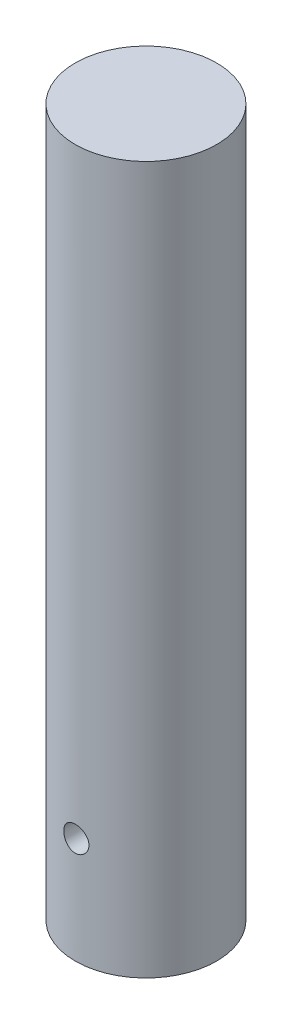
ISO-10303-21;
HEADER;
FILE_DESCRIPTION(('STEP AP214'),'2;1');
FILE_NAME('part.step','',(''),(''),'','','');
FILE_SCHEMA(('AUTOMOTIVE_DESIGN { 1 0 10303 214 1 1 1 1 }'));
ENDSEC;
DATA;
#1=APPLICATION_CONTEXT('core data for automotive mechanical design processes');
#2=APPLICATION_PROTOCOL_DEFINITION('international standard','automotive_design',2000,#1);
#3=PRODUCT_CONTEXT('',#1,'mechanical');
#4=PRODUCT('Part','Part','',(#3));
#5=PRODUCT_RELATED_PRODUCT_CATEGORY('part','',(#4));
#6=PRODUCT_DEFINITION_FORMATION('','',#4);
#7=PRODUCT_DEFINITION_CONTEXT('part definition',#1,'design');
#8=PRODUCT_DEFINITION('design','',#6,#7);
#9=PRODUCT_DEFINITION_SHAPE('','',#8);
#10=(LENGTH_UNIT() NAMED_UNIT(*) SI_UNIT(.MILLI.,.METRE.));
#11=(NAMED_UNIT(*) PLANE_ANGLE_UNIT() SI_UNIT($,.RADIAN.));
#12=(NAMED_UNIT(*) SI_UNIT($,.STERADIAN.) SOLID_ANGLE_UNIT());
#13=UNCERTAINTY_MEASURE_WITH_UNIT(LENGTH_MEASURE(1.E-05),#10,'distance_accuracy_value','');
#14=(GEOMETRIC_REPRESENTATION_CONTEXT(3) GLOBAL_UNCERTAINTY_ASSIGNED_CONTEXT((#13)) GLOBAL_UNIT_ASSIGNED_CONTEXT((#10,
#11,#12)) REPRESENTATION_CONTEXT('',''));
#15=CARTESIAN_POINT('',(0.,0.,0.));
#16=DIRECTION('',(0.,0.,1.));
#17=DIRECTION('',(1.,0.,0.));
#18=AXIS2_PLACEMENT_3D('',#15,#16,#17);
#19=CARTESIAN_POINT('',(0.,0.,0.));
#20=DIRECTION('',(0.,1.,0.));
#21=DIRECTION('',(0.,0.,1.));
#22=AXIS2_PLACEMENT_3D('',#19,#20,#21);
#23=PLANE('',#22);
#24=CARTESIAN_POINT('',(0.,0.,0.));
#25=DIRECTION('',(0.,1.,0.));
#26=DIRECTION('',(0.,0.,1.));
#27=AXIS2_PLACEMENT_3D('',#24,#25,#26);
#28=CIRCLE('',#27,6.35);
#29=CARTESIAN_POINT('',(0.,0.,6.35));
#30=VERTEX_POINT('',#29);
#31=EDGE_CURVE('E37',#30,#30,#28,.T.);
#32=ORIENTED_EDGE('',*,*,#31,.F.);
#33=EDGE_LOOP('',(#32));
#34=FACE_BOUND('',#33,.T.);
#35=CARTESIAN_POINT('',(0.,0.,0.));
#36=DIRECTION('',(0.,1.,0.));
#37=DIRECTION('',(0.,0.,1.));
#38=AXIS2_PLACEMENT_3D('',#35,#36,#37);
#39=CIRCLE('',#38,3.175);
#40=CARTESIAN_POINT('',(0.,0.,3.175));
#41=VERTEX_POINT('',#40);
#42=EDGE_CURVE('E46',#41,#41,#39,.T.);
#43=ORIENTED_EDGE('',*,*,#42,.T.);
#44=EDGE_LOOP('',(#43));
#45=FACE_BOUND('',#44,.T.);
#46=ADVANCED_FACE('F33',(#34,#45),#23,.F.);
#47=CARTESIAN_POINT('',(0.,63.5,0.));
#48=DIRECTION('',(0.,-1.,0.));
#49=DIRECTION('',(0.,0.,-1.));
#50=AXIS2_PLACEMENT_3D('',#47,#48,#49);
#51=CYLINDRICAL_SURFACE('',#50,6.35);
#52=CARTESIAN_POINT('',(-1.13029999999999,9.525,6.2485935945619));
#53=CARTESIAN_POINT('',(-1.13029752860319,9.5879474816605,6.24859477928636));
#54=CARTESIAN_POINT('',(-1.12502376655343,9.65092772669888,6.24955510147455));
#55=CARTESIAN_POINT('',(-1.10407989662447,9.77511645744907,6.253288450742));
#56=CARTESIAN_POINT('',(-1.08840060868597,9.83632332883139,6.25606307842284));
#57=CARTESIAN_POINT('',(-1.04713896619608,9.95515026397906,6.26310106017997));
#58=CARTESIAN_POINT('',(-1.02156538976728,10.0127734547007,6.26736309431536));
#59=CARTESIAN_POINT('',(-0.961263736790334,10.1229065233361,6.27689410394912));
#60=CARTESIAN_POINT('',(-0.926536522350171,10.1754168821493,6.28216298460781));
#61=CARTESIAN_POINT('',(-0.848497662550803,10.2744282501686,6.29318010060458));
#62=CARTESIAN_POINT('',(-0.805103209146809,10.3208635240626,6.29893262327816));
#63=CARTESIAN_POINT('',(-0.711140656114692,10.4058346900162,6.31023089151142));
#64=CARTESIAN_POINT('',(-0.66057210782028,10.4443700876505,6.31577662411108));
#65=CARTESIAN_POINT('',(-0.553267727306871,10.5126971356988,6.3260821366722));
#66=CARTESIAN_POINT('',(-0.496492076393623,10.5424271753841,6.33083628120179));
#67=CARTESIAN_POINT('',(-0.37865347562094,10.5919030822544,6.33897509325521));
#68=CARTESIAN_POINT('',(-0.317590843835827,10.6116496892748,6.34235986225469));
#69=CARTESIAN_POINT('',(-0.193591929496425,10.6403959469096,6.34734827608291));
#70=CARTESIAN_POINT('',(-0.13068204924793,10.6495062530837,6.34897024782024));
#71=CARTESIAN_POINT('',(-0.00420718696588065,10.6570657608453,6.35031338922828));
#72=CARTESIAN_POINT('',(0.0593577441923792,10.6555157842373,6.35003470542113));
#73=CARTESIAN_POINT('',(0.184580543784088,10.6418842622789,6.34762234490442));
#74=CARTESIAN_POINT('',(0.246251841595395,10.6299218357653,6.34550965008509));
#75=CARTESIAN_POINT('',(0.366697607884808,10.5959929907874,6.33969011077832));
#76=CARTESIAN_POINT('',(0.425471978630503,10.5740262350669,6.33598321254887));
#77=CARTESIAN_POINT('',(0.538805120450367,10.520596503427,6.32735638635074));
#78=CARTESIAN_POINT('',(0.593340631871778,10.4890852229098,6.32243031191731));
#79=CARTESIAN_POINT('',(0.696394590932207,10.4174964249582,6.31191110570192));
#80=CARTESIAN_POINT('',(0.744912484459758,10.3774181195831,6.30631791258354));
#81=CARTESIAN_POINT('',(0.835258832297383,10.2891745040808,6.29499388871477));
#82=CARTESIAN_POINT('',(0.876985499299344,10.2409050230152,6.28926222422367));
#83=CARTESIAN_POINT('',(0.951765111250195,10.1379981203382,6.27838159660169));
#84=CARTESIAN_POINT('',(0.984817952788772,10.0833606228178,6.27323264041835));
#85=CARTESIAN_POINT('',(1.04133641697596,9.96914166467476,6.26409955120621));
#86=CARTESIAN_POINT('',(1.06478844399583,9.90955333578239,6.26011707226906));
#87=CARTESIAN_POINT('',(1.10132048259893,9.78719582604085,6.25379407198502));
#88=CARTESIAN_POINT('',(1.11440154509544,9.72442696816782,6.25145338427448));
#89=CARTESIAN_POINT('',(1.12967421074341,9.59840468476552,6.24871157429963));
#90=CARTESIAN_POINT('',(1.1320115149774,9.53516946405966,6.24828450262102));
#91=CARTESIAN_POINT('',(1.12611980656729,9.40921190744061,6.24934899119854));
#92=CARTESIAN_POINT('',(1.11789126229031,9.34648954891709,6.25084046640858));
#93=CARTESIAN_POINT('',(1.09122611970098,9.2238095478001,6.25554991782972));
#94=CARTESIAN_POINT('',(1.0728648576672,9.16383499749475,6.25875514695102));
#95=CARTESIAN_POINT('',(1.02653498701514,9.04781385159104,6.26652011136834));
#96=CARTESIAN_POINT('',(0.998565732092787,8.99176752053895,6.27107993778172));
#97=CARTESIAN_POINT('',(0.933474479097977,8.88454878726828,6.28109997867828));
#98=CARTESIAN_POINT('',(0.896259814835742,8.83343349045936,6.28656911125703));
#99=CARTESIAN_POINT('',(0.813860130740534,8.73812065938619,6.29776598333193));
#100=CARTESIAN_POINT('',(0.768674468015049,8.69392368365494,6.30349374365968));
#101=CARTESIAN_POINT('',(0.670967135208991,8.61316353360304,6.3146452745759));
#102=CARTESIAN_POINT('',(0.618364201269161,8.57669796577111,6.3200645909399));
#103=CARTESIAN_POINT('',(0.507694087392306,8.51312217243746,6.32991535892806));
#104=CARTESIAN_POINT('',(0.449627102767368,8.4860116127032,6.33434684584306));
#105=CARTESIAN_POINT('',(0.329956377996443,8.4420642471255,6.34170339516869));
#106=CARTESIAN_POINT('',(0.268371245166509,8.42517803607878,6.34463569095833));
#107=CARTESIAN_POINT('',(0.143182328625896,8.40200033003815,6.34869419748068));
#108=CARTESIAN_POINT('',(0.079578736033763,8.39570783500608,6.34982057868977));
#109=CARTESIAN_POINT('',(-0.0469027850895823,8.39392816748321,6.35013741439244));
#110=CARTESIAN_POINT('',(-0.109778614269501,8.3982930711384,6.3493543717336));
#111=CARTESIAN_POINT('',(-0.233886077679075,8.41738221219446,6.34599495704242));
#112=CARTESIAN_POINT('',(-0.295117724437978,8.43210637063088,6.34341859867981));
#113=CARTESIAN_POINT('',(-0.414130647219044,8.47143628901858,6.3367614767518));
#114=CARTESIAN_POINT('',(-0.471916767035401,8.49602778217131,6.33268288590209));
#115=CARTESIAN_POINT('',(-0.58256515759116,8.55437720115281,6.32346454814742));
#116=CARTESIAN_POINT('',(-0.635427142672243,8.58813565833019,6.31832473973479));
#117=CARTESIAN_POINT('',(-0.735467702991127,8.66437711212491,6.30746821917931));
#118=CARTESIAN_POINT('',(-0.78256358646994,8.7069676821887,6.3017448838471));
#119=CARTESIAN_POINT('',(-0.868991600851839,8.79943981221691,6.29041003362776));
#120=CARTESIAN_POINT('',(-0.908321908493048,8.84932307964371,6.28479854527831));
#121=CARTESIAN_POINT('',(-0.978402705974913,8.95545289515873,6.2742726933168));
#122=CARTESIAN_POINT('',(-1.00908013748217,9.0117483036151,6.26936442851344));
#123=CARTESIAN_POINT('',(-1.06049430719682,9.12876063547626,6.26087346378715));
#124=CARTESIAN_POINT('',(-1.08124068756143,9.18947320395225,6.25728947888211));
#125=CARTESIAN_POINT('',(-1.10785061597257,9.29616068175458,6.2526226773509));
#126=CARTESIAN_POINT('',(-1.11625514641399,9.34150046594738,6.2511204717796));
#127=CARTESIAN_POINT('',(-1.12748067941379,9.43288766220765,6.24910550811149));
#128=CARTESIAN_POINT('',(-1.13030180856718,9.47893505820727,6.24859272758102));
#129=CARTESIAN_POINT('',(-1.13029999999999,9.525,6.2485935945619));
#130=B_SPLINE_CURVE_WITH_KNOTS('',3,(#52,#53,#54,#55,#56,#57,#58,#59,#60,#61,#62,#63,#64,#65,
#66,#67,#68,#69,#70,#71,#72,#73,#74,#75,#76,#77,#78,#79,#80,#81,#82,#83,#84,#85,#86,#87,#88,#89,
#90,#91,#92,#93,#94,#95,#96,#97,#98,#99,#100,#101,#102,#103,#104,#105,#106,#107,#108,#109,#110,
#111,#112,#113,#114,#115,#116,#117,#118,#119,#120,#121,#122,#123,#124,#125,#126,#127,#128,#129),
.UNSPECIFIED.,.T.,.F.,(4,2,2,2,2,2,2,2,2,2,2,2,2,2,2,2,2,2,2,2,2,2,2,2,2,2,2,2,2,2,2,2,2,2,2,2,
2,2,4),(0.,0.188673929647675,0.377514534626134,0.566187984707758,0.754843671490903,
0.945396353842148,1.13596095857323,1.32782903745417,1.51968289561748,1.70952248173693,
1.89934743322767,2.08702890424998,2.27471670267542,2.46337072228332,2.65204210056538,
2.84332262546283,3.03460543072441,3.22615818062713,3.41769151757452,3.60661956640558,
3.79553924064845,3.98307286921061,4.17061911513111,4.36012684649337,4.54964986939676,
4.74143924348981,4.9332217646882,5.12407001760688,5.31490025359549,5.50309687534889,
5.69129206257057,5.87921612052187,6.06715107352074,6.25752581883361,6.44794520878682,
6.63992726090079,6.83172253573711,6.96979717232726,7.10786867825187),.UNSPECIFIED.);
#131=CARTESIAN_POINT('',(-1.13029999999999,9.525,6.2485935945619));
#132=VERTEX_POINT('',#131);
#133=EDGE_CURVE('E58',#132,#132,#130,.T.);
#134=ORIENTED_EDGE('',*,*,#133,.T.);
#135=EDGE_LOOP('',(#134));
#136=FACE_BOUND('',#135,.T.);
#137=CARTESIAN_POINT('',(0.,63.5,0.));
#138=DIRECTION('',(0.,1.,0.));
#139=DIRECTION('',(0.,0.,1.));
#140=AXIS2_PLACEMENT_3D('',#137,#138,#139);
#141=CIRCLE('',#140,6.35);
#142=CARTESIAN_POINT('',(0.,63.5,6.35));
#143=VERTEX_POINT('',#142);
#144=EDGE_CURVE('E10',#143,#143,#141,.T.);
#145=ORIENTED_EDGE('',*,*,#144,.F.);
#146=EDGE_LOOP('',(#145));
#147=FACE_BOUND('',#146,.T.);
#148=ORIENTED_EDGE('',*,*,#31,.T.);
#149=EDGE_LOOP('',(#148));
#150=FACE_BOUND('',#149,.T.);
#151=ADVANCED_FACE('F35',(#136,#147,#150),#51,.T.);
#152=CARTESIAN_POINT('',(0.,63.5,0.));
#153=DIRECTION('',(0.,1.,0.));
#154=DIRECTION('',(0.,0.,1.));
#155=AXIS2_PLACEMENT_3D('',#152,#153,#154);
#156=PLANE('',#155);
#157=ORIENTED_EDGE('',*,*,#144,.T.);
#158=EDGE_LOOP('',(#157));
#159=FACE_BOUND('',#158,.T.);
#160=ADVANCED_FACE('F78',(#159),#156,.T.);
#161=CARTESIAN_POINT('',(0.,19.05,0.));
#162=DIRECTION('',(0.,-1.,0.));
#163=DIRECTION('',(0.,0.,-1.));
#164=AXIS2_PLACEMENT_3D('',#161,#162,#163);
#165=CYLINDRICAL_SURFACE('',#164,3.175);
#166=CARTESIAN_POINT('',(-1.13029999999999,9.525,2.96699290696827));
#167=CARTESIAN_POINT('',(-1.1303012694956,9.58628895933851,2.96699180092178));
#168=CARTESIAN_POINT('',(-1.12529831217773,9.64756912734574,2.96891266523162));
#169=CARTESIAN_POINT('',(-1.10549852105485,9.7682967619217,2.976341367105));
#170=CARTESIAN_POINT('',(-1.09070115134953,9.82774412802257,2.9818494009399));
#171=CARTESIAN_POINT('',(-1.05191211633807,9.94303375248211,2.9957511550193));
#172=CARTESIAN_POINT('',(-1.02794056093623,9.99888358601857,3.00413855954279));
#173=CARTESIAN_POINT('',(-0.971553767874782,10.1057892496279,3.02284430324832));
#174=CARTESIAN_POINT('',(-0.939136285381996,10.1568438002525,3.03316315558203));
#175=CARTESIAN_POINT('',(-0.865225378101699,10.2549922068566,3.05508626986901));
#176=CARTESIAN_POINT('',(-0.823416737479133,10.3018408906158,3.06672572194972));
#177=CARTESIAN_POINT('',(-0.732580946565025,10.388032143363,3.08968323184446));
#178=CARTESIAN_POINT('',(-0.683552447130746,10.4273733062926,3.1010012291171));
#179=CARTESIAN_POINT('',(-0.577839731348622,10.4985812799959,3.1224537652803));
#180=CARTESIAN_POINT('',(-0.520968849300914,10.5301861088022,3.13254217002369));
#181=CARTESIAN_POINT('',(-0.402295832054573,10.583280559294,3.14997980235623));
#182=CARTESIAN_POINT('',(-0.340495233260626,10.6047733182321,3.15732987935941));
#183=CARTESIAN_POINT('',(-0.216291429363958,10.6361870998813,3.16821317131574));
#184=CARTESIAN_POINT('',(-0.154007098319546,10.6465292278104,3.17188488321263));
#185=CARTESIAN_POINT('',(-0.0284859904407212,10.6566926063867,3.1754922345549));
#186=CARTESIAN_POINT('',(0.0347505016117876,10.6565169426782,3.17542896974461));
#187=CARTESIAN_POINT('',(0.157380355815444,10.6459052574599,3.17166431166137));
#188=CARTESIAN_POINT('',(0.216819232200464,10.6359277784678,3.16812551082658));
#189=CARTESIAN_POINT('',(0.333116055100483,10.6067608770257,3.15801637664471));
#190=CARTESIAN_POINT('',(0.389973821301092,10.5875708120723,3.15144583185916));
#191=CARTESIAN_POINT('',(0.500434290449893,10.5402854109935,3.13581701279072));
#192=CARTESIAN_POINT('',(0.553980350398548,10.5120692866645,3.12672523235359));
#193=CARTESIAN_POINT('',(0.65570490163449,10.4476359137555,3.10698647045265));
#194=CARTESIAN_POINT('',(0.703881757104609,10.411416236731,3.09633901729824));
#195=CARTESIAN_POINT('',(0.796215706775613,10.3297461139334,3.07392952110036));
#196=CARTESIAN_POINT('',(0.840022503287883,10.2839070461925,3.06213831691244));
#197=CARTESIAN_POINT('',(0.919450536225363,10.1854473787285,3.03923485845035));
#198=CARTESIAN_POINT('',(0.955070114455709,10.1328254085954,3.02812274204891));
#199=CARTESIAN_POINT('',(1.01769271316584,10.0210407298505,3.00766281876103));
#200=CARTESIAN_POINT('',(1.04452651167637,9.96177612967642,2.99835093480064));
#201=CARTESIAN_POINT('',(1.08770687791102,9.83915205397106,2.98296002370199));
#202=CARTESIAN_POINT('',(1.10405859416821,9.77579460560261,2.97687940969726));
#203=CARTESIAN_POINT('',(1.12505332850272,9.65021503860933,2.96900658684162));
#204=CARTESIAN_POINT('',(1.13024679297078,9.58809761280379,2.96701300712206));
#205=CARTESIAN_POINT('',(1.13035235934411,9.4638602858632,2.96697312971029));
#206=CARTESIAN_POINT('',(1.12526668272105,9.40174038816366,2.96892597913741));
#207=CARTESIAN_POINT('',(1.10545550475943,9.28193036305256,2.97635611028256));
#208=CARTESIAN_POINT('',(1.0911347174114,9.22416310068884,2.98168526601896));
#209=CARTESIAN_POINT('',(1.05375787852424,9.11187043471946,2.99509779472349));
#210=CARTESIAN_POINT('',(1.03070014678854,9.05734565700897,3.00318169742524));
#211=CARTESIAN_POINT('',(0.97559321940054,8.95097129922113,3.0215413409512));
#212=CARTESIAN_POINT('',(0.943258091531729,8.89928168380078,3.03188377797999));
#213=CARTESIAN_POINT('',(0.870827536052556,8.80186484108613,3.0534751542732));
#214=CARTESIAN_POINT('',(0.83072951959391,8.75613961139509,3.06472439521551));
#215=CARTESIAN_POINT('',(0.741245393025417,8.66929317369057,3.0876248127599));
#216=CARTESIAN_POINT('',(0.691464443347557,8.62857410614688,3.09926313882807));
#217=CARTESIAN_POINT('',(0.585488794794458,8.55602974620421,3.12101743586169));
#218=CARTESIAN_POINT('',(0.529294210180939,8.52420429539636,3.13113343394065));
#219=CARTESIAN_POINT('',(0.412253306959741,8.47060696262934,3.14867455762266));
#220=CARTESIAN_POINT('',(0.351432796366104,8.44878347797622,3.15611345134428));
#221=CARTESIAN_POINT('',(0.226662836118677,8.41578342922617,3.16751726579441));
#222=CARTESIAN_POINT('',(0.162714706431157,8.40460241370645,3.17148363891749));
#223=CARTESIAN_POINT('',(0.0371588940228251,8.39364837319486,3.17537085125336));
#224=CARTESIAN_POINT('',(-0.0243929105435879,8.39330146129778,3.17549520012136));
#225=CARTESIAN_POINT('',(-0.146637730412363,8.40257767236957,3.1722011158763));
#226=CARTESIAN_POINT('',(-0.2073308320097,8.41219978618739,3.16878304135799));
#227=CARTESIAN_POINT('',(-0.324899902225856,8.44074667687977,3.1588730580352));
#228=CARTESIAN_POINT('',(-0.38182822637077,8.45947950967657,3.15244466988758));
#229=CARTESIAN_POINT('',(-0.491747356923693,8.50553174671115,3.13717898355161));
#230=CARTESIAN_POINT('',(-0.544737424039249,8.53285275811939,3.12834123452256));
#231=CARTESIAN_POINT('',(-0.647587160628668,8.59655356575111,3.10871467602532));
#232=CARTESIAN_POINT('',(-0.697237489818607,8.63325138385077,3.0978620760476));
#233=CARTESIAN_POINT('',(-0.789857808823595,8.71414474726443,3.07555250387425));
#234=CARTESIAN_POINT('',(-0.832825512939457,8.75834284718424,3.06409532667805));
#235=CARTESIAN_POINT('',(-0.912898108309833,8.85542271395284,3.04122635424545));
#236=CARTESIAN_POINT('',(-0.949639270596966,8.90861186744156,3.0298412400875));
#237=CARTESIAN_POINT('',(-1.01365584279661,9.02077015218018,3.00903053343651));
#238=CARTESIAN_POINT('',(-1.04093198735494,9.07973883438485,2.99960478888596));
#239=CARTESIAN_POINT('',(-1.08510912643681,9.20197635775262,2.9839099977344));
#240=CARTESIAN_POINT('',(-1.10199264087852,9.26525224610705,2.97764627271748));
#241=CARTESIAN_POINT('',(-1.12458464442987,9.39402284176739,2.96918932171509));
#242=CARTESIAN_POINT('',(-1.13029864362041,9.45951643881527,2.96699408871232));
#243=CARTESIAN_POINT('',(-1.13029999999999,9.525,2.96699290696827));
#244=B_SPLINE_CURVE_WITH_KNOTS('',3,(#166,#167,#168,#169,#170,#171,#172,#173,#174,#175,#176,
#177,#178,#179,#180,#181,#182,#183,#184,#185,#186,#187,#188,#189,#190,#191,#192,#193,#194,#195,
#196,#197,#198,#199,#200,#201,#202,#203,#204,#205,#206,#207,#208,#209,#210,#211,#212,#213,#214,
#215,#216,#217,#218,#219,#220,#221,#222,#223,#224,#225,#226,#227,#228,#229,#230,#231,#232,#233,
#234,#235,#236,#237,#238,#239,#240,#241,#242,#243),.UNSPECIFIED.,.T.,.F.,(4,2,2,2,2,2,2,2,2,2,2,
2,2,2,2,2,2,2,2,2,2,2,2,2,2,2,2,2,2,2,2,2,2,2,2,2,2,2,4),(0.,0.183623661784848,
0.367257371351084,0.550490838429556,0.733773056690739,0.924501319590951,1.11526526836208,
1.31179756529309,1.50826884814032,1.69702812609222,1.88573202729145,2.06600906280414,
2.24629867301315,2.42910965891791,2.61197618983502,2.80457310610199,2.99720899560135,
3.19336255385325,3.38941969247875,3.57555921531924,3.76165851500697,3.94011049494311,
4.11859681030483,4.30331748902534,4.48809987675373,4.68324756844092,4.87839178402885,
5.07251754238686,5.26656206808727,5.45030949868021,5.63403833058543,5.81405386702812,
5.9941031112074,6.18133819670183,6.36863718318309,6.56461137244538,6.76057034738458,
6.95685802501446,7.15304884667681),.UNSPECIFIED.);
#245=CARTESIAN_POINT('',(-1.13029999999999,9.525,2.96699290696827));
#246=VERTEX_POINT('',#245);
#247=EDGE_CURVE('E49',#246,#246,#244,.T.);
#248=ORIENTED_EDGE('',*,*,#247,.F.);
#249=EDGE_LOOP('',(#248));
#250=FACE_BOUND('',#249,.T.);
#251=CARTESIAN_POINT('',(0.,19.05,0.));
#252=DIRECTION('',(0.,1.,0.));
#253=DIRECTION('',(0.,0.,1.));
#254=AXIS2_PLACEMENT_3D('',#251,#252,#253);
#255=CIRCLE('',#254,3.175);
#256=CARTESIAN_POINT('',(0.,19.05,3.175));
#257=VERTEX_POINT('',#256);
#258=EDGE_CURVE('E44',#257,#257,#255,.T.);
#259=ORIENTED_EDGE('',*,*,#258,.T.);
#260=EDGE_LOOP('',(#259));
#261=FACE_BOUND('',#260,.T.);
#262=ORIENTED_EDGE('',*,*,#42,.F.);
#263=EDGE_LOOP('',(#262));
#264=FACE_BOUND('',#263,.T.);
#265=ADVANCED_FACE('F62',(#250,#261,#264),#165,.F.);
#266=CARTESIAN_POINT('',(0.,19.05,0.));
#267=DIRECTION('',(0.,1.,0.));
#268=DIRECTION('',(0.,0.,1.));
#269=AXIS2_PLACEMENT_3D('',#266,#267,#268);
#270=PLANE('',#269);
#271=ORIENTED_EDGE('',*,*,#258,.F.);
#272=EDGE_LOOP('',(#271));
#273=FACE_BOUND('',#272,.T.);
#274=ADVANCED_FACE('F69',(#273),#270,.F.);
#275=CARTESIAN_POINT('',(0.,9.525,0.));
#276=DIRECTION('',(0.,0.,-1.));
#277=DIRECTION('',(-1.,0.,0.));
#278=AXIS2_PLACEMENT_3D('',#275,#276,#277);
#279=CYLINDRICAL_SURFACE('',#278,1.13029999999999);
#280=ORIENTED_EDGE('',*,*,#247,.T.);
#281=EDGE_LOOP('',(#280));
#282=FACE_BOUND('',#281,.T.);
#283=ORIENTED_EDGE('',*,*,#133,.F.);
#284=EDGE_LOOP('',(#283));
#285=FACE_BOUND('',#284,.T.);
#286=ADVANCED_FACE('F66',(#282,#285),#279,.F.);
#287=CLOSED_SHELL('',(#46,#151,#160,#265,#274,#286));
#288=MANIFOLD_SOLID_BREP('B2',#287);
#289=ADVANCED_BREP_SHAPE_REPRESENTATION('',(#18,#288),#14);
#290=SHAPE_DEFINITION_REPRESENTATION(#9,#289);
ENDSEC;
END-ISO-10303-21;
